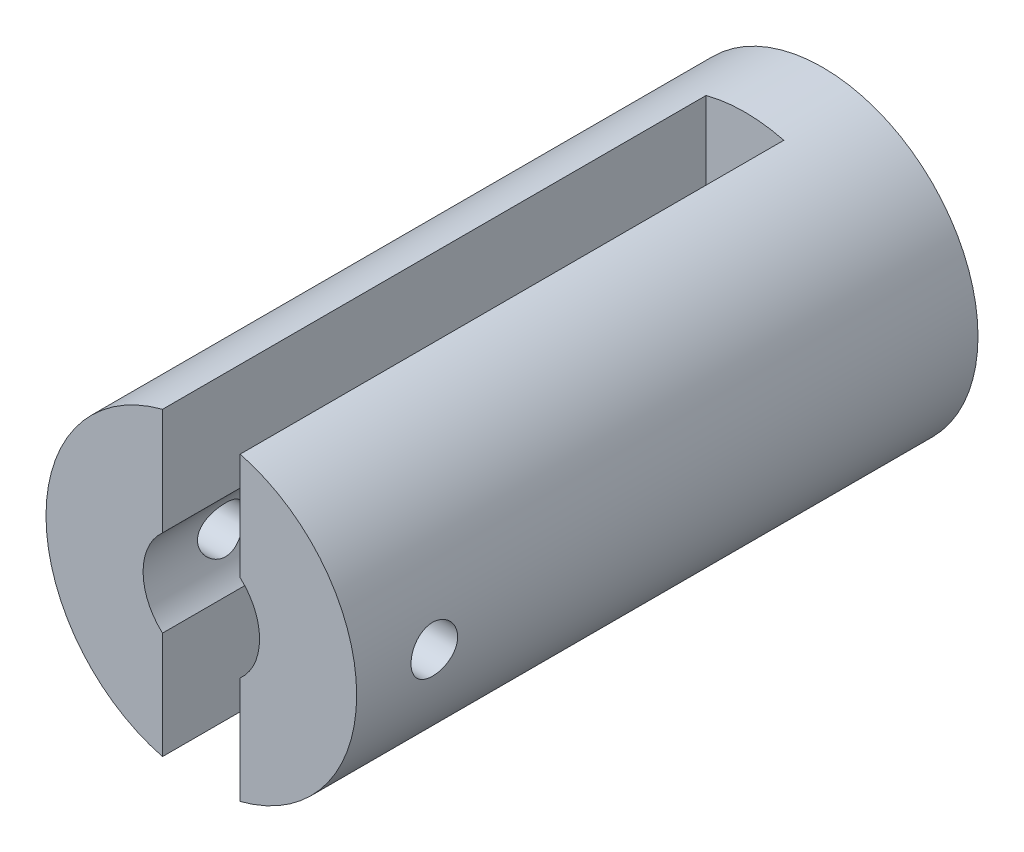
ISO-10303-21;
HEADER;
FILE_DESCRIPTION(('STEP AP214'),'2;1');
FILE_NAME('part.step','',(''),(''),'','','');
FILE_SCHEMA(('AUTOMOTIVE_DESIGN { 1 0 10303 214 1 1 1 1 }'));
ENDSEC;
DATA;
#1=APPLICATION_CONTEXT('core data for automotive mechanical design processes');
#2=APPLICATION_PROTOCOL_DEFINITION('international standard','automotive_design',2000,#1);
#3=PRODUCT_CONTEXT('',#1,'mechanical');
#4=PRODUCT('Part','Part','',(#3));
#5=PRODUCT_RELATED_PRODUCT_CATEGORY('part','',(#4));
#6=PRODUCT_DEFINITION_FORMATION('','',#4);
#7=PRODUCT_DEFINITION_CONTEXT('part definition',#1,'design');
#8=PRODUCT_DEFINITION('design','',#6,#7);
#9=PRODUCT_DEFINITION_SHAPE('','',#8);
#10=(LENGTH_UNIT() NAMED_UNIT(*) SI_UNIT(.MILLI.,.METRE.));
#11=(NAMED_UNIT(*) PLANE_ANGLE_UNIT() SI_UNIT($,.RADIAN.));
#12=(NAMED_UNIT(*) SI_UNIT($,.STERADIAN.) SOLID_ANGLE_UNIT());
#13=UNCERTAINTY_MEASURE_WITH_UNIT(LENGTH_MEASURE(1.E-05),#10,'distance_accuracy_value','');
#14=(GEOMETRIC_REPRESENTATION_CONTEXT(3) GLOBAL_UNCERTAINTY_ASSIGNED_CONTEXT((#13)) GLOBAL_UNIT_ASSIGNED_CONTEXT((#10,
#11,#12)) REPRESENTATION_CONTEXT('',''));
#15=CARTESIAN_POINT('',(0.,0.,0.));
#16=DIRECTION('',(0.,0.,1.));
#17=DIRECTION('',(1.,0.,0.));
#18=AXIS2_PLACEMENT_3D('',#15,#16,#17);
#19=CARTESIAN_POINT('',(2.5,-9.68245836551854,40.));
#20=DIRECTION('',(1.,0.,0.));
#21=DIRECTION('',(0.,0.,-1.));
#22=AXIS2_PLACEMENT_3D('',#19,#20,#21);
#23=PLANE('',#22);
#24=DIRECTION('',(0.,0.,-1.));
#25=VECTOR('',#24,1.);
#26=CARTESIAN_POINT('',(2.5,-2.79508497187474,51.5));
#27=LINE('',#26,#25);
#28=CARTESIAN_POINT('',(2.5,-2.79508497187474,5.));
#29=VERTEX_POINT('',#28);
#30=CARTESIAN_POINT('',(2.5,-2.79508497187474,40.));
#31=VERTEX_POINT('',#30);
#32=EDGE_CURVE('E182',#29,#31,#27,.F.);
#33=ORIENTED_EDGE('',*,*,#32,.F.);
#34=DIRECTION('',(0.,-1.,0.));
#35=VECTOR('',#34,1.);
#36=CARTESIAN_POINT('',(2.5,-9.68245836551854,5.));
#37=LINE('',#36,#35);
#38=CARTESIAN_POINT('',(2.5,-9.68245836551854,5.));
#39=VERTEX_POINT('',#38);
#40=EDGE_CURVE('E136',#29,#39,#37,.T.);
#41=ORIENTED_EDGE('',*,*,#40,.T.);
#42=DIRECTION('',(0.,0.,-1.));
#43=VECTOR('',#42,1.);
#44=CARTESIAN_POINT('',(2.5,-9.68245836551854,40.));
#45=LINE('',#44,#43);
#46=CARTESIAN_POINT('',(2.5,-9.68245836551854,40.));
#47=VERTEX_POINT('',#46);
#48=EDGE_CURVE('E144',#47,#39,#45,.T.);
#49=ORIENTED_EDGE('',*,*,#48,.F.);
#50=DIRECTION('',(0.,-1.,0.));
#51=VECTOR('',#50,1.);
#52=CARTESIAN_POINT('',(2.5,-9.68245836551854,40.));
#53=LINE('',#52,#51);
#54=EDGE_CURVE('E140',#31,#47,#53,.T.);
#55=ORIENTED_EDGE('',*,*,#54,.F.);
#56=EDGE_LOOP('',(#33,#41,#49,#55));
#57=FACE_BOUND('',#56,.T.);
#58=ADVANCED_FACE('F33',(#57),#23,.F.);
#59=DIRECTION('',(0.,0.,-1.));
#60=VECTOR('',#59,1.);
#61=CARTESIAN_POINT('',(2.5,2.79508497187474,51.5));
#62=LINE('',#61,#60);
#63=CARTESIAN_POINT('',(2.5,2.79508497187474,40.));
#64=VERTEX_POINT('',#63);
#65=CARTESIAN_POINT('',(2.5,2.79508497187474,5.));
#66=VERTEX_POINT('',#65);
#67=EDGE_CURVE('E113',#64,#66,#62,.T.);
#68=ORIENTED_EDGE('',*,*,#67,.F.);
#69=CARTESIAN_POINT('',(2.5,9.68245836551854,40.));
#70=VERTEX_POINT('',#69);
#71=EDGE_CURVE('E141',#70,#64,#53,.T.);
#72=ORIENTED_EDGE('',*,*,#71,.F.);
#73=DIRECTION('',(0.,0.,-1.));
#74=VECTOR('',#73,1.);
#75=CARTESIAN_POINT('',(2.5,9.68245836551854,40.));
#76=LINE('',#75,#74);
#77=CARTESIAN_POINT('',(2.5,9.68245836551854,5.));
#78=VERTEX_POINT('',#77);
#79=EDGE_CURVE('E165',#70,#78,#76,.T.);
#80=ORIENTED_EDGE('',*,*,#79,.T.);
#81=EDGE_CURVE('E57',#78,#66,#37,.T.);
#82=ORIENTED_EDGE('',*,*,#81,.T.);
#83=EDGE_LOOP('',(#68,#72,#80,#82));
#84=FACE_BOUND('',#83,.T.);
#85=ADVANCED_FACE('F239',(#84),#23,.F.);
#86=CARTESIAN_POINT('',(0.,0.,40.));
#87=DIRECTION('',(0.,0.,1.));
#88=DIRECTION('',(1.,0.,0.));
#89=AXIS2_PLACEMENT_3D('',#86,#87,#88);
#90=PLANE('',#89);
#91=ORIENTED_EDGE('',*,*,#71,.T.);
#92=CARTESIAN_POINT('',(0.,0.,40.));
#93=DIRECTION('',(0.,0.,1.));
#94=DIRECTION('',(1.,0.,0.));
#95=AXIS2_PLACEMENT_3D('',#92,#93,#94);
#96=CIRCLE('',#95,3.75);
#97=EDGE_CURVE('E222',#64,#31,#96,.F.);
#98=ORIENTED_EDGE('',*,*,#97,.T.);
#99=ORIENTED_EDGE('',*,*,#54,.T.);
#100=CARTESIAN_POINT('',(0.,0.,40.));
#101=DIRECTION('',(0.,0.,1.));
#102=DIRECTION('',(1.,0.,0.));
#103=AXIS2_PLACEMENT_3D('',#100,#101,#102);
#104=CIRCLE('',#103,10.);
#105=EDGE_CURVE('E137',#47,#70,#104,.T.);
#106=ORIENTED_EDGE('',*,*,#105,.T.);
#107=EDGE_LOOP('',(#91,#98,#99,#106));
#108=FACE_BOUND('',#107,.T.);
#109=ADVANCED_FACE('F244',(#108),#90,.T.);
#110=CARTESIAN_POINT('',(-2.5,-9.68245836551854,40.));
#111=DIRECTION('',(-1.,0.,0.));
#112=DIRECTION('',(0.,0.,1.));
#113=AXIS2_PLACEMENT_3D('',#110,#111,#112);
#114=PLANE('',#113);
#115=DIRECTION('',(0.,0.,-1.));
#116=VECTOR('',#115,1.);
#117=CARTESIAN_POINT('',(-2.5,2.79508497187474,51.5));
#118=LINE('',#117,#116);
#119=CARTESIAN_POINT('',(-2.5,2.79508497187474,5.));
#120=VERTEX_POINT('',#119);
#121=CARTESIAN_POINT('',(-2.5,2.79508497187474,40.));
#122=VERTEX_POINT('',#121);
#123=EDGE_CURVE('E100',#120,#122,#118,.F.);
#124=ORIENTED_EDGE('',*,*,#123,.F.);
#125=DIRECTION('',(0.,1.,0.));
#126=VECTOR('',#125,1.);
#127=CARTESIAN_POINT('',(-2.5,-9.68245836551854,5.));
#128=LINE('',#127,#126);
#129=CARTESIAN_POINT('',(-2.5,9.68245836551854,5.));
#130=VERTEX_POINT('',#129);
#131=EDGE_CURVE('E51',#120,#130,#128,.T.);
#132=ORIENTED_EDGE('',*,*,#131,.T.);
#133=DIRECTION('',(0.,0.,-1.));
#134=VECTOR('',#133,1.);
#135=CARTESIAN_POINT('',(-2.5,9.68245836551854,40.));
#136=LINE('',#135,#134);
#137=CARTESIAN_POINT('',(-2.5,9.68245836551854,40.));
#138=VERTEX_POINT('',#137);
#139=EDGE_CURVE('E131',#138,#130,#136,.T.);
#140=ORIENTED_EDGE('',*,*,#139,.F.);
#141=DIRECTION('',(0.,1.,0.));
#142=VECTOR('',#141,1.);
#143=CARTESIAN_POINT('',(-2.5,-9.68245836551854,40.));
#144=LINE('',#143,#142);
#145=EDGE_CURVE('E103',#122,#138,#144,.T.);
#146=ORIENTED_EDGE('',*,*,#145,.F.);
#147=EDGE_LOOP('',(#124,#132,#140,#146));
#148=FACE_BOUND('',#147,.T.);
#149=ADVANCED_FACE('F102',(#148),#114,.F.);
#150=DIRECTION('',(0.,0.,-1.));
#151=VECTOR('',#150,1.);
#152=CARTESIAN_POINT('',(-2.5,-2.79508497187474,51.5));
#153=LINE('',#152,#151);
#154=CARTESIAN_POINT('',(-2.5,-2.79508497187474,40.));
#155=VERTEX_POINT('',#154);
#156=CARTESIAN_POINT('',(-2.5,-2.79508497187474,5.));
#157=VERTEX_POINT('',#156);
#158=EDGE_CURVE('E107',#155,#157,#153,.T.);
#159=ORIENTED_EDGE('',*,*,#158,.F.);
#160=CARTESIAN_POINT('',(-2.5,-9.68245836551854,40.));
#161=VERTEX_POINT('',#160);
#162=EDGE_CURVE('E129',#161,#155,#144,.T.);
#163=ORIENTED_EDGE('',*,*,#162,.F.);
#164=DIRECTION('',(0.,0.,-1.));
#165=VECTOR('',#164,1.);
#166=CARTESIAN_POINT('',(-2.5,-9.68245836551854,40.));
#167=LINE('',#166,#165);
#168=CARTESIAN_POINT('',(-2.5,-9.68245836551854,5.));
#169=VERTEX_POINT('',#168);
#170=EDGE_CURVE('E133',#161,#169,#167,.T.);
#171=ORIENTED_EDGE('',*,*,#170,.T.);
#172=EDGE_CURVE('E119',#169,#157,#128,.T.);
#173=ORIENTED_EDGE('',*,*,#172,.T.);
#174=EDGE_LOOP('',(#159,#163,#171,#173));
#175=FACE_BOUND('',#174,.T.);
#176=ADVANCED_FACE('F189',(#175),#114,.F.);
#177=CARTESIAN_POINT('',(0.,0.,40.));
#178=DIRECTION('',(0.,0.,1.));
#179=DIRECTION('',(1.,0.,0.));
#180=AXIS2_PLACEMENT_3D('',#177,#178,#179);
#181=PLANE('',#180);
#182=ORIENTED_EDGE('',*,*,#162,.T.);
#183=CARTESIAN_POINT('',(0.,0.,40.));
#184=DIRECTION('',(0.,0.,1.));
#185=DIRECTION('',(1.,0.,0.));
#186=AXIS2_PLACEMENT_3D('',#183,#184,#185);
#187=CIRCLE('',#186,3.75);
#188=EDGE_CURVE('E106',#155,#122,#187,.F.);
#189=ORIENTED_EDGE('',*,*,#188,.T.);
#190=ORIENTED_EDGE('',*,*,#145,.T.);
#191=CARTESIAN_POINT('',(0.,0.,40.));
#192=DIRECTION('',(0.,0.,1.));
#193=DIRECTION('',(1.,0.,0.));
#194=AXIS2_PLACEMENT_3D('',#191,#192,#193);
#195=CIRCLE('',#194,10.);
#196=EDGE_CURVE('E123',#138,#161,#195,.T.);
#197=ORIENTED_EDGE('',*,*,#196,.T.);
#198=EDGE_LOOP('',(#182,#189,#190,#197));
#199=FACE_BOUND('',#198,.T.);
#200=ADVANCED_FACE('F206',(#199),#181,.T.);
#201=CARTESIAN_POINT('',(22.5,0.,35.));
#202=DIRECTION('',(-1.,0.,0.));
#203=DIRECTION('',(0.,0.,1.));
#204=AXIS2_PLACEMENT_3D('',#201,#202,#203);
#205=CYLINDRICAL_SURFACE('',#204,1.5);
#206=CARTESIAN_POINT('',(-10.,0.,36.5));
#207=CARTESIAN_POINT('',(-9.99999865771297,-0.0837515444816427,36.4999965461848));
#208=CARTESIAN_POINT('',(-9.9989368253704,-0.167551685082133,36.4929619991594));
#209=CARTESIAN_POINT('',(-9.99480315973187,-0.332809627994914,36.4650168000173));
#210=CARTESIAN_POINT('',(-9.99172936938473,-0.41426506897423,36.4440926370551));
#211=CARTESIAN_POINT('',(-9.98391721219526,-0.572418086221861,36.3890074950324));
#212=CARTESIAN_POINT('',(-9.97918010370919,-0.649119207826799,36.3548565204941));
#213=CARTESIAN_POINT('',(-9.96856475911724,-0.795690428635255,36.2743116205831));
#214=CARTESIAN_POINT('',(-9.96268668152773,-0.865561474725191,36.2279193955826));
#215=CARTESIAN_POINT('',(-9.95039170991452,-0.997046719562129,36.1238227350601));
#216=CARTESIAN_POINT('',(-9.94397133890331,-1.0585998322255,36.0660415437918));
#217=CARTESIAN_POINT('',(-9.93134261133239,-1.17117490668949,35.9409723111061));
#218=CARTESIAN_POINT('',(-9.92513426698505,-1.22219626272936,35.8736837232215));
#219=CARTESIAN_POINT('',(-9.91359877458726,-1.31249729499943,35.7310993564775));
#220=CARTESIAN_POINT('',(-9.90827611975031,-1.35171787037205,35.6557657530187));
#221=CARTESIAN_POINT('',(-9.89916211306268,-1.41692632171056,35.4994871793546));
#222=CARTESIAN_POINT('',(-9.89537067775449,-1.44291491889163,35.4185425152561));
#223=CARTESIAN_POINT('',(-9.88978256218673,-1.48073198798911,35.2539819581283));
#224=CARTESIAN_POINT('',(-9.8879711574125,-1.49266503640518,35.170390606592));
#225=CARTESIAN_POINT('',(-9.88650348970582,-1.50235624033933,35.0023738340127));
#226=CARTESIAN_POINT('',(-9.88684710303147,-1.50011520973797,34.9179484611375));
#227=CARTESIAN_POINT('',(-9.88963718352409,-1.48160733250788,34.7513989198059));
#228=CARTESIAN_POINT('',(-9.89206618761549,-1.46545695927751,34.6692614735152));
#229=CARTESIAN_POINT('',(-9.89872608126367,-1.41977117403735,34.5088756311285));
#230=CARTESIAN_POINT('',(-9.90295702179379,-1.39023538337812,34.4306273451193));
#231=CARTESIAN_POINT('',(-9.91276335545481,-1.31849603529737,34.2798866287171));
#232=CARTESIAN_POINT('',(-9.91834396766526,-1.27624314283198,34.2074180309076));
#233=CARTESIAN_POINT('',(-9.93021707574548,-1.18030413128955,34.0705554042181));
#234=CARTESIAN_POINT('',(-9.93650961832501,-1.12661726182479,34.0061619057306));
#235=CARTESIAN_POINT('',(-9.9491747305621,-1.00869493078248,33.8866023392603));
#236=CARTESIAN_POINT('',(-9.95554747112815,-0.944359329642007,33.8315350097137));
#237=CARTESIAN_POINT('',(-9.96759647648462,-0.807307089894192,33.7329640654927));
#238=CARTESIAN_POINT('',(-9.9732727382251,-0.734590414588176,33.6894605014561));
#239=CARTESIAN_POINT('',(-9.98329515585393,-0.58275459821369,33.6152469135005));
#240=CARTESIAN_POINT('',(-9.98764051925428,-0.503631677836783,33.5845445081597));
#241=CARTESIAN_POINT('',(-9.99450490557069,-0.341273182487061,33.5368906103146));
#242=CARTESIAN_POINT('',(-9.99702405195467,-0.2580378859526,33.5199381881844));
#243=CARTESIAN_POINT('',(-9.99993581133871,-0.0906695676436447,33.5003967701833));
#244=CARTESIAN_POINT('',(-10.0003485209039,-0.00655273187046912,33.4976720286207));
#245=CARTESIAN_POINT('',(-9.99905561015226,0.160936677662284,33.506303005311));
#246=CARTESIAN_POINT('',(-9.99735005541369,0.244309274381878,33.5176582876681));
#247=CARTESIAN_POINT('',(-9.99202468615333,0.407532387431409,33.5540141001775));
#248=CARTESIAN_POINT('',(-9.98841415207984,0.487397963079839,33.5789484960308));
#249=CARTESIAN_POINT('',(-9.97968235658369,0.641814958643,33.6416849974618));
#250=CARTESIAN_POINT('',(-9.97456102421565,0.716366128795101,33.6794877073336));
#251=CARTESIAN_POINT('',(-9.96332682468686,0.858634979291924,33.7672062245639));
#252=CARTESIAN_POINT('',(-9.95720701626745,0.92629900989157,33.8172081400128));
#253=CARTESIAN_POINT('',(-9.94467863012165,1.05232367317771,33.9277858116287));
#254=CARTESIAN_POINT('',(-9.93827003562867,1.11068376479341,33.9883621823247));
#255=CARTESIAN_POINT('',(-9.92582264304494,1.21693784957196,34.1189735331765));
#256=CARTESIAN_POINT('',(-9.91978736017588,1.26474084747421,34.1890829251948));
#257=CARTESIAN_POINT('',(-9.90883219104903,1.34789129270584,34.3364160405118));
#258=CARTESIAN_POINT('',(-9.90391227465629,1.38323907656436,34.4136395715215));
#259=CARTESIAN_POINT('',(-9.89577033008645,1.44033467323944,34.5727375336231));
#260=CARTESIAN_POINT('',(-9.89254233006438,1.46213037141636,34.6545944609712));
#261=CARTESIAN_POINT('',(-9.88813382297802,1.49165549501587,34.8208590154351));
#262=CARTESIAN_POINT('',(-9.88695317451771,1.49938589183067,34.9052664659947));
#263=CARTESIAN_POINT('',(-9.88677832610841,1.5005378666944,35.0733290633158));
#264=CARTESIAN_POINT('',(-9.88776226333502,1.49410252167313,35.1569832417569));
#265=CARTESIAN_POINT('',(-9.89175820611174,1.46741229544379,35.3220052633235));
#266=CARTESIAN_POINT('',(-9.89477020841118,1.44715743638627,35.4033731101134));
#267=CARTESIAN_POINT('',(-9.90247526112297,1.39345373518666,35.5614730822343));
#268=CARTESIAN_POINT('',(-9.90716703716075,1.36001489324314,35.6382086704334));
#269=CARTESIAN_POINT('',(-9.91770454557702,1.28090667642309,35.7850036338024));
#270=CARTESIAN_POINT('',(-9.92355031702723,1.23523688741502,35.8550627828036));
#271=CARTESIAN_POINT('',(-9.93580743364938,1.13244337659164,35.9872430579752));
#272=CARTESIAN_POINT('',(-9.94222367881967,1.07521369039806,36.0492813332471));
#273=CARTESIAN_POINT('',(-9.95485788826637,0.951148841082835,36.1629245547878));
#274=CARTESIAN_POINT('',(-9.96107580610759,0.884311448350943,36.2145270725762));
#275=CARTESIAN_POINT('',(-9.9726518579052,0.742495707543724,36.3060876766074));
#276=CARTESIAN_POINT('',(-9.9780050712882,0.667474576764763,36.3459801092148));
#277=CARTESIAN_POINT('',(-9.9872002880296,0.511751870248722,36.412538516758));
#278=CARTESIAN_POINT('',(-9.99104385565757,0.431056277096709,36.4392181900537));
#279=CARTESIAN_POINT('',(-9.99590939261506,0.291665727889334,36.4725413427101));
#280=CARTESIAN_POINT('',(-9.99743549179557,0.233831133495283,36.4828226015388));
#281=CARTESIAN_POINT('',(-9.99948125947896,0.117338971600127,36.4965530977126));
#282=CARTESIAN_POINT('',(-10.0000009404877,0.0586814143344182,36.5000024199526));
#283=CARTESIAN_POINT('',(-10.,0.,36.5));
#284=B_SPLINE_CURVE_WITH_KNOTS('',3,(#206,#207,#208,#209,#210,#211,#212,#213,#214,#215,#216,
#217,#218,#219,#220,#221,#222,#223,#224,#225,#226,#227,#228,#229,#230,#231,#232,#233,#234,#235,
#236,#237,#238,#239,#240,#241,#242,#243,#244,#245,#246,#247,#248,#249,#250,#251,#252,#253,#254,
#255,#256,#257,#258,#259,#260,#261,#262,#263,#264,#265,#266,#267,#268,#269,#270,#271,#272,#273,
#274,#275,#276,#277,#278,#279,#280,#281,#282,#283),.UNSPECIFIED.,.T.,.F.,(4,2,2,2,2,2,2,2,2,2,2,
2,2,2,2,2,2,2,2,2,2,2,2,2,2,2,2,2,2,2,2,2,2,2,2,2,2,2,4),(0.,0.251040205031665,
0.502324962929151,0.753420023583239,1.0044802241976,1.25729416136844,1.5101226357258,
1.76419702395375,2.01825756225506,2.27041564605925,2.52255925098983,2.77261177195747,
3.02267136690362,3.27371383476159,3.52477278308534,3.77834291255409,4.03191415238668,
4.28563608984875,4.53934087193402,4.79062058544256,5.04189251991156,5.29195148965949,
5.54202220376275,5.79391188036909,6.04581620028631,6.29981366584673,6.55380426808834,
6.8068922345717,7.05996272137179,7.31048888261066,7.56101464229565,7.81135073984148,
8.06169531466881,8.31444829965723,8.56726003468735,8.82146323384735,9.07540233261443,
9.2512985197881,9.42719252123293),.UNSPECIFIED.);
#285=CARTESIAN_POINT('',(-10.,0.,36.5));
#286=VERTEX_POINT('',#285);
#287=EDGE_CURVE('E120',#286,#286,#284,.T.);
#288=ORIENTED_EDGE('',*,*,#287,.F.);
#289=EDGE_LOOP('',(#288));
#290=FACE_BOUND('',#289,.T.);
#291=CARTESIAN_POINT('',(-3.75,0.,36.5));
#292=CARTESIAN_POINT('',(-3.74999453420313,0.0806197540821692,36.4999926111322));
#293=CARTESIAN_POINT('',(-3.74736970730199,0.161379423068007,36.4934616859337));
#294=CARTESIAN_POINT('',(-3.73712589825481,0.320622360313424,36.4675642223591));
#295=CARTESIAN_POINT('',(-3.72949334024158,0.399098833170937,36.4481627906854));
#296=CARTESIAN_POINT('',(-3.71005656909839,0.551215442045552,36.3973429414559));
#297=CARTESIAN_POINT('',(-3.69826602273054,0.624870496212719,36.3659638653375));
#298=CARTESIAN_POINT('',(-3.67167458097058,0.765803977746276,36.2922356200051));
#299=CARTESIAN_POINT('',(-3.65687473093542,0.833084607563246,36.2498902588108));
#300=CARTESIAN_POINT('',(-3.62498164627814,0.962625755677798,36.1533233760793));
#301=CARTESIAN_POINT('',(-3.60781722696893,1.02454670441266,36.0986700078198));
#302=CARTESIAN_POINT('',(-3.57345432679646,1.13863125358854,35.9799499973924));
#303=CARTESIAN_POINT('',(-3.55625583340344,1.19079008035015,35.9158787770912));
#304=CARTESIAN_POINT('',(-3.52292093847852,1.28615592546966,35.7766789473183));
#305=CARTESIAN_POINT('',(-3.50686586973713,1.32886123589661,35.7011851354826));
#306=CARTESIAN_POINT('',(-3.47875235390094,1.40081603927787,35.543347701185));
#307=CARTESIAN_POINT('',(-3.46669200933132,1.43007192321438,35.4610073541137));
#308=CARTESIAN_POINT('',(-3.44869768245614,1.47292411754691,35.2957157498059));
#309=CARTESIAN_POINT('',(-3.44251065266703,1.48717047435424,35.2129615733178));
#310=CARTESIAN_POINT('',(-3.43623003036858,1.50162972123003,35.0460237512696));
#311=CARTESIAN_POINT('',(-3.43613344142076,1.50184951223492,34.9618408290312));
#312=CARTESIAN_POINT('',(-3.44182875209995,1.48874202562841,34.8006824964065));
#313=CARTESIAN_POINT('',(-3.44721131278837,1.47635648572886,34.7236132141932));
#314=CARTESIAN_POINT('',(-3.46257140705877,1.43996016022337,34.572755332995));
#315=CARTESIAN_POINT('',(-3.47254974241254,1.41594734610348,34.4989673089173));
#316=CARTESIAN_POINT('',(-3.49619613816397,1.35652104941331,34.354986622853));
#317=CARTESIAN_POINT('',(-3.50993534460591,1.32088489673649,34.284898070709));
#318=CARTESIAN_POINT('',(-3.53953587292417,1.23937984554916,34.1514381377288));
#319=CARTESIAN_POINT('',(-3.55539799092636,1.19350710382564,34.0880692929479));
#320=CARTESIAN_POINT('',(-3.58895052556703,1.08866294959083,33.9646927033985));
#321=CARTESIAN_POINT('',(-3.60668748732114,1.02895309722798,33.9053234529155));
#322=CARTESIAN_POINT('',(-3.64094868718711,0.900235820572651,33.7972366414985));
#323=CARTESIAN_POINT('',(-3.65747268333993,0.831226549000833,33.7485212019423));
#324=CARTESIAN_POINT('',(-3.68786010948411,0.68405823945439,33.6622869144381));
#325=CARTESIAN_POINT('',(-3.70166452571561,0.605745368509865,33.6250082891022));
#326=CARTESIAN_POINT('',(-3.72461121246569,0.443267824112167,33.5643741041915));
#327=CARTESIAN_POINT('',(-3.73375585096787,0.35910614763726,33.5410114718319));
#328=CARTESIAN_POINT('',(-3.74592104630183,0.192671915705868,33.5101637784352));
#329=CARTESIAN_POINT('',(-3.74927209375136,0.110582470489153,33.5018206593098));
#330=CARTESIAN_POINT('',(-3.75051358882973,-0.0538839823558609,33.4987151746035));
#331=CARTESIAN_POINT('',(-3.74840545186719,-0.136260909917941,33.5039492888394));
#332=CARTESIAN_POINT('',(-3.73918175297815,-0.295074554341489,33.527218814414));
#333=CARTESIAN_POINT('',(-3.73229543509143,-0.371611868831603,33.5446684852632));
#334=CARTESIAN_POINT('',(-3.71444581054125,-0.520601571045583,33.5910767812324));
#335=CARTESIAN_POINT('',(-3.70348198017398,-0.593053432668632,33.6200368847515));
#336=CARTESIAN_POINT('',(-3.67812446078109,-0.734309089362527,33.68958870476));
#337=CARTESIAN_POINT('',(-3.66363611984853,-0.802933517066556,33.7305091040324));
#338=CARTESIAN_POINT('',(-3.63280023559143,-0.932582693434919,33.8224552429292));
#339=CARTESIAN_POINT('',(-3.61645194832703,-0.993604380570845,33.873485032192));
#340=CARTESIAN_POINT('',(-3.58233838228584,-1.11054228227162,33.9881525097122));
#341=CARTESIAN_POINT('',(-3.56455081068789,-1.16585545035455,34.0524001561297));
#342=CARTESIAN_POINT('',(-3.53056254687849,-1.26506339806029,34.189580062257));
#343=CARTESIAN_POINT('',(-3.51436211644883,-1.30895629600313,34.262513750255));
#344=CARTESIAN_POINT('',(-3.48535724930781,-1.38435562644873,34.4160962709456));
#345=CARTESIAN_POINT('',(-3.47258723163591,-1.41573794590085,34.4968129994092));
#346=CARTESIAN_POINT('',(-3.45242755108448,-1.46422216477898,34.6630502387864));
#347=CARTESIAN_POINT('',(-3.44503391771999,-1.48133460395199,34.7485671543593));
#348=CARTESIAN_POINT('',(-3.43703819474945,-1.4997867129588,34.9153459263309));
#349=CARTESIAN_POINT('',(-3.43598565756128,-1.50217281172715,34.996471129695));
#350=CARTESIAN_POINT('',(-3.43961127024823,-1.49385236945815,35.157908643285));
#351=CARTESIAN_POINT('',(-3.44428869243595,-1.48314749093534,35.2382210554269));
#352=CARTESIAN_POINT('',(-3.45844986809265,-1.44980352461524,35.3924991423913));
#353=CARTESIAN_POINT('',(-3.46773623870587,-1.42765312017824,35.4665902058248));
#354=CARTESIAN_POINT('',(-3.48993000924522,-1.37250408636826,35.6100339722101));
#355=CARTESIAN_POINT('',(-3.50283840904505,-1.33950246104536,35.6793853601749));
#356=CARTESIAN_POINT('',(-3.53173957203368,-1.2614045720698,35.8157072144531));
#357=CARTESIAN_POINT('',(-3.54786661734931,-1.21572400136962,35.8823140025979));
#358=CARTESIAN_POINT('',(-3.58097853279178,-1.11441908945363,36.0072449879028));
#359=CARTESIAN_POINT('',(-3.59796366036305,-1.05879175111359,36.0655666790962));
#360=CARTESIAN_POINT('',(-3.63220175315545,-0.93487912970435,36.1761521399477));
#361=CARTESIAN_POINT('',(-3.64940068471639,-0.866007000859608,36.2277779801736));
#362=CARTESIAN_POINT('',(-3.68100305035287,-0.71992524021434,36.3187527819662));
#363=CARTESIAN_POINT('',(-3.6954051831968,-0.642711753410433,36.3580960341144));
#364=CARTESIAN_POINT('',(-3.71954786111896,-0.483553546871405,36.4224666613927));
#365=CARTESIAN_POINT('',(-3.72937022291271,-0.401723713664773,36.4477469926703));
#366=CARTESIAN_POINT('',(-3.74358229657024,-0.234657409710915,36.4839793407157));
#367=CARTESIAN_POINT('',(-3.74798924621728,-0.149432644394184,36.4949768275579));
#368=CARTESIAN_POINT('',(-3.74981924628102,-0.0426842234181974,36.4995465357337));
#369=CARTESIAN_POINT('',(-3.75000144726882,-0.0213470165555689,36.5000019564719));
#370=CARTESIAN_POINT('',(-3.75,0.,36.5));
#371=B_SPLINE_CURVE_WITH_KNOTS('',3,(#291,#292,#293,#294,#295,#296,#297,#298,#299,#300,#301,
#302,#303,#304,#305,#306,#307,#308,#309,#310,#311,#312,#313,#314,#315,#316,#317,#318,#319,#320,
#321,#322,#323,#324,#325,#326,#327,#328,#329,#330,#331,#332,#333,#334,#335,#336,#337,#338,#339,
#340,#341,#342,#343,#344,#345,#346,#347,#348,#349,#350,#351,#352,#353,#354,#355,#356,#357,#358,
#359,#360,#361,#362,#363,#364,#365,#366,#367,#368,#369,#370),.UNSPECIFIED.,.T.,.F.,(4,2,2,2,2,2,
2,2,2,2,2,2,2,2,2,2,2,2,2,2,2,2,2,2,2,2,2,2,2,2,2,2,2,2,2,2,2,2,2,4),(0.,0.241802240919805,
0.484262727005952,0.725933593103685,0.967520651759883,1.21948036275298,1.47156296200809,
1.73486444114413,1.99804067338702,2.24928078981623,2.50039729755366,2.7340374630103,
2.96771840442036,3.20616844724113,3.44470816453638,3.70168761889918,3.958718196298,
4.22082684872105,4.48280217085344,4.72926888396007,4.97567170177563,5.21100341673275,
5.44636536745349,5.68892635048699,5.93158469624228,6.19026355968312,6.44898501782812,
6.71021283855624,6.97124754484452,7.21349755044563,7.45571679422286,7.68835738911579,
7.92106226853872,8.16709101042521,8.41319401011297,8.67525317650379,8.93743397730402,
9.19473225759992,9.45120939303259,9.51523534422599),.UNSPECIFIED.);
#372=CARTESIAN_POINT('',(-3.75,0.,36.5));
#373=VERTEX_POINT('',#372);
#374=EDGE_CURVE('E221',#373,#373,#371,.T.);
#375=ORIENTED_EDGE('',*,*,#374,.F.);
#376=EDGE_LOOP('',(#375));
#377=FACE_BOUND('',#376,.T.);
#378=ADVANCED_FACE('F200',(#290,#377),#205,.F.);
#379=CARTESIAN_POINT('',(10.,0.,36.5));
#380=CARTESIAN_POINT('',(9.99999865771297,0.0837515444816427,36.4999965461848));
#381=CARTESIAN_POINT('',(9.9989368253704,0.167551685082133,36.4929619991594));
#382=CARTESIAN_POINT('',(9.99480315973187,0.332809627994914,36.4650168000173));
#383=CARTESIAN_POINT('',(9.99172936938473,0.41426506897423,36.4440926370551));
#384=CARTESIAN_POINT('',(9.98391721219526,0.572418086221861,36.3890074950324));
#385=CARTESIAN_POINT('',(9.97918010370919,0.649119207826799,36.3548565204941));
#386=CARTESIAN_POINT('',(9.96856475911724,0.795690428635255,36.2743116205831));
#387=CARTESIAN_POINT('',(9.96268668152773,0.865561474725191,36.2279193955826));
#388=CARTESIAN_POINT('',(9.95039170991452,0.997046719562129,36.1238227350601));
#389=CARTESIAN_POINT('',(9.94397133890331,1.0585998322255,36.0660415437918));
#390=CARTESIAN_POINT('',(9.93134261133239,1.17117490668949,35.9409723111061));
#391=CARTESIAN_POINT('',(9.92513426698505,1.22219626272936,35.8736837232215));
#392=CARTESIAN_POINT('',(9.91359877458726,1.31249729499943,35.7310993564775));
#393=CARTESIAN_POINT('',(9.90827611975031,1.35171787037205,35.6557657530187));
#394=CARTESIAN_POINT('',(9.89916211306268,1.41692632171056,35.4994871793546));
#395=CARTESIAN_POINT('',(9.89537067775449,1.44291491889163,35.4185425152561));
#396=CARTESIAN_POINT('',(9.88978256218673,1.48073198798911,35.2539819581283));
#397=CARTESIAN_POINT('',(9.8879711574125,1.49266503640518,35.170390606592));
#398=CARTESIAN_POINT('',(9.88650348970582,1.50235624033933,35.0023738340127));
#399=CARTESIAN_POINT('',(9.88684710303147,1.50011520973797,34.9179484611375));
#400=CARTESIAN_POINT('',(9.88963718352409,1.48160733250788,34.7513989198059));
#401=CARTESIAN_POINT('',(9.89206618761549,1.46545695927751,34.6692614735152));
#402=CARTESIAN_POINT('',(9.89872608126367,1.41977117403735,34.5088756311285));
#403=CARTESIAN_POINT('',(9.90295702179379,1.39023538337812,34.4306273451193));
#404=CARTESIAN_POINT('',(9.91276335545481,1.31849603529737,34.2798866287171));
#405=CARTESIAN_POINT('',(9.91834396766526,1.27624314283198,34.2074180309076));
#406=CARTESIAN_POINT('',(9.93021707574548,1.18030413128955,34.0705554042181));
#407=CARTESIAN_POINT('',(9.93650961832501,1.12661726182479,34.0061619057306));
#408=CARTESIAN_POINT('',(9.9491747305621,1.00869493078248,33.8866023392603));
#409=CARTESIAN_POINT('',(9.95554747112815,0.944359329642007,33.8315350097137));
#410=CARTESIAN_POINT('',(9.96759647648462,0.807307089894192,33.7329640654927));
#411=CARTESIAN_POINT('',(9.9732727382251,0.734590414588176,33.6894605014561));
#412=CARTESIAN_POINT('',(9.98329515585393,0.58275459821369,33.6152469135005));
#413=CARTESIAN_POINT('',(9.98764051925428,0.503631677836783,33.5845445081597));
#414=CARTESIAN_POINT('',(9.99450490557069,0.341273182487061,33.5368906103146));
#415=CARTESIAN_POINT('',(9.99702405195467,0.2580378859526,33.5199381881844));
#416=CARTESIAN_POINT('',(9.99993581133871,0.0906695676436447,33.5003967701833));
#417=CARTESIAN_POINT('',(10.0003485209039,0.00655273187046912,33.4976720286207));
#418=CARTESIAN_POINT('',(9.99905561015226,-0.160936677662284,33.506303005311));
#419=CARTESIAN_POINT('',(9.99735005541369,-0.244309274381878,33.5176582876681));
#420=CARTESIAN_POINT('',(9.99202468615333,-0.407532387431409,33.5540141001775));
#421=CARTESIAN_POINT('',(9.98841415207984,-0.487397963079839,33.5789484960308));
#422=CARTESIAN_POINT('',(9.97968235658369,-0.641814958643,33.6416849974618));
#423=CARTESIAN_POINT('',(9.97456102421565,-0.716366128795101,33.6794877073336));
#424=CARTESIAN_POINT('',(9.96332682468686,-0.858634979291924,33.7672062245639));
#425=CARTESIAN_POINT('',(9.95720701626745,-0.92629900989157,33.8172081400128));
#426=CARTESIAN_POINT('',(9.94467863012165,-1.05232367317771,33.9277858116287));
#427=CARTESIAN_POINT('',(9.93827003562867,-1.11068376479341,33.9883621823247));
#428=CARTESIAN_POINT('',(9.92582264304494,-1.21693784957196,34.1189735331765));
#429=CARTESIAN_POINT('',(9.91978736017588,-1.26474084747421,34.1890829251948));
#430=CARTESIAN_POINT('',(9.90883219104903,-1.34789129270584,34.3364160405118));
#431=CARTESIAN_POINT('',(9.90391227465629,-1.38323907656436,34.4136395715215));
#432=CARTESIAN_POINT('',(9.89577033008645,-1.44033467323944,34.5727375336231));
#433=CARTESIAN_POINT('',(9.89254233006438,-1.46213037141636,34.6545944609712));
#434=CARTESIAN_POINT('',(9.88813382297802,-1.49165549501587,34.8208590154351));
#435=CARTESIAN_POINT('',(9.88695317451771,-1.49938589183067,34.9052664659947));
#436=CARTESIAN_POINT('',(9.88677832610841,-1.5005378666944,35.0733290633158));
#437=CARTESIAN_POINT('',(9.88776226333502,-1.49410252167313,35.1569832417569));
#438=CARTESIAN_POINT('',(9.89175820611174,-1.46741229544379,35.3220052633235));
#439=CARTESIAN_POINT('',(9.89477020841118,-1.44715743638627,35.4033731101134));
#440=CARTESIAN_POINT('',(9.90247526112297,-1.39345373518666,35.5614730822343));
#441=CARTESIAN_POINT('',(9.90716703716075,-1.36001489324314,35.6382086704334));
#442=CARTESIAN_POINT('',(9.91770454557702,-1.28090667642309,35.7850036338024));
#443=CARTESIAN_POINT('',(9.92355031702723,-1.23523688741502,35.8550627828036));
#444=CARTESIAN_POINT('',(9.93580743364938,-1.13244337659164,35.9872430579752));
#445=CARTESIAN_POINT('',(9.94222367881967,-1.07521369039806,36.0492813332471));
#446=CARTESIAN_POINT('',(9.95485788826637,-0.951148841082835,36.1629245547878));
#447=CARTESIAN_POINT('',(9.96107580610759,-0.884311448350943,36.2145270725762));
#448=CARTESIAN_POINT('',(9.9726518579052,-0.742495707543724,36.3060876766074));
#449=CARTESIAN_POINT('',(9.9780050712882,-0.667474576764763,36.3459801092148));
#450=CARTESIAN_POINT('',(9.9872002880296,-0.511751870248722,36.412538516758));
#451=CARTESIAN_POINT('',(9.99104385565757,-0.431056277096709,36.4392181900537));
#452=CARTESIAN_POINT('',(9.99590939261506,-0.291665727889334,36.4725413427101));
#453=CARTESIAN_POINT('',(9.99743549179557,-0.233831133495283,36.4828226015388));
#454=CARTESIAN_POINT('',(9.99948125947896,-0.117338971600127,36.4965530977126));
#455=CARTESIAN_POINT('',(10.0000009404877,-0.0586814143344182,36.5000024199526));
#456=CARTESIAN_POINT('',(10.,0.,36.5));
#457=B_SPLINE_CURVE_WITH_KNOTS('',3,(#379,#380,#381,#382,#383,#384,#385,#386,#387,#388,#389,
#390,#391,#392,#393,#394,#395,#396,#397,#398,#399,#400,#401,#402,#403,#404,#405,#406,#407,#408,
#409,#410,#411,#412,#413,#414,#415,#416,#417,#418,#419,#420,#421,#422,#423,#424,#425,#426,#427,
#428,#429,#430,#431,#432,#433,#434,#435,#436,#437,#438,#439,#440,#441,#442,#443,#444,#445,#446,
#447,#448,#449,#450,#451,#452,#453,#454,#455,#456),.UNSPECIFIED.,.T.,.F.,(4,2,2,2,2,2,2,2,2,2,2,
2,2,2,2,2,2,2,2,2,2,2,2,2,2,2,2,2,2,2,2,2,2,2,2,2,2,2,4),(0.,0.251040205031665,
0.502324962929151,0.753420023583239,1.0044802241976,1.25729416136844,1.5101226357258,
1.76419702395375,2.01825756225506,2.27041564605925,2.52255925098983,2.77261177195747,
3.02267136690362,3.27371383476159,3.52477278308534,3.77834291255409,4.03191415238668,
4.28563608984875,4.53934087193402,4.79062058544256,5.04189251991156,5.29195148965949,
5.54202220376275,5.79391188036909,6.04581620028631,6.29981366584673,6.55380426808834,
6.8068922345717,7.05996272137179,7.31048888261066,7.56101464229565,7.81135073984148,
8.06169531466881,8.31444829965723,8.56726003468735,8.82146323384735,9.07540233261443,
9.2512985197881,9.42719252123293),.UNSPECIFIED.);
#458=CARTESIAN_POINT('',(10.,0.,36.5));
#459=VERTEX_POINT('',#458);
#460=EDGE_CURVE('E125',#459,#459,#457,.T.);
#461=ORIENTED_EDGE('',*,*,#460,.F.);
#462=EDGE_LOOP('',(#461));
#463=FACE_BOUND('',#462,.T.);
#464=CARTESIAN_POINT('',(3.75,0.,36.5));
#465=CARTESIAN_POINT('',(3.74999453420313,-0.0806197540821692,36.4999926111322));
#466=CARTESIAN_POINT('',(3.74736970730199,-0.161379423068007,36.4934616859337));
#467=CARTESIAN_POINT('',(3.73712589825481,-0.320622360313424,36.4675642223591));
#468=CARTESIAN_POINT('',(3.72949334024158,-0.399098833170937,36.4481627906854));
#469=CARTESIAN_POINT('',(3.71005656909839,-0.551215442045552,36.3973429414559));
#470=CARTESIAN_POINT('',(3.69826602273054,-0.624870496212719,36.3659638653375));
#471=CARTESIAN_POINT('',(3.67167458097058,-0.765803977746276,36.2922356200051));
#472=CARTESIAN_POINT('',(3.65687473093542,-0.833084607563246,36.2498902588108));
#473=CARTESIAN_POINT('',(3.62498164627814,-0.962625755677798,36.1533233760793));
#474=CARTESIAN_POINT('',(3.60781722696893,-1.02454670441266,36.0986700078198));
#475=CARTESIAN_POINT('',(3.57345432679646,-1.13863125358854,35.9799499973924));
#476=CARTESIAN_POINT('',(3.55625583340344,-1.19079008035015,35.9158787770912));
#477=CARTESIAN_POINT('',(3.52292093847852,-1.28615592546966,35.7766789473183));
#478=CARTESIAN_POINT('',(3.50686586973713,-1.32886123589661,35.7011851354826));
#479=CARTESIAN_POINT('',(3.47875235390094,-1.40081603927787,35.543347701185));
#480=CARTESIAN_POINT('',(3.46669200933132,-1.43007192321438,35.4610073541137));
#481=CARTESIAN_POINT('',(3.44869768245614,-1.47292411754691,35.2957157498059));
#482=CARTESIAN_POINT('',(3.44251065266703,-1.48717047435424,35.2129615733178));
#483=CARTESIAN_POINT('',(3.43623003036858,-1.50162972123003,35.0460237512696));
#484=CARTESIAN_POINT('',(3.43613344142076,-1.50184951223492,34.9618408290312));
#485=CARTESIAN_POINT('',(3.44182875209995,-1.48874202562841,34.8006824964065));
#486=CARTESIAN_POINT('',(3.44721131278837,-1.47635648572886,34.7236132141932));
#487=CARTESIAN_POINT('',(3.46257140705877,-1.43996016022337,34.572755332995));
#488=CARTESIAN_POINT('',(3.47254974241254,-1.41594734610348,34.4989673089173));
#489=CARTESIAN_POINT('',(3.49619613816397,-1.35652104941331,34.354986622853));
#490=CARTESIAN_POINT('',(3.50993534460591,-1.32088489673649,34.284898070709));
#491=CARTESIAN_POINT('',(3.53953587292417,-1.23937984554916,34.1514381377288));
#492=CARTESIAN_POINT('',(3.55539799092636,-1.19350710382564,34.0880692929479));
#493=CARTESIAN_POINT('',(3.58895052556703,-1.08866294959083,33.9646927033985));
#494=CARTESIAN_POINT('',(3.60668748732114,-1.02895309722798,33.9053234529155));
#495=CARTESIAN_POINT('',(3.64094868718711,-0.900235820572651,33.7972366414985));
#496=CARTESIAN_POINT('',(3.65747268333993,-0.831226549000833,33.7485212019423));
#497=CARTESIAN_POINT('',(3.68786010948411,-0.68405823945439,33.6622869144381));
#498=CARTESIAN_POINT('',(3.70166452571561,-0.605745368509865,33.6250082891022));
#499=CARTESIAN_POINT('',(3.72461121246569,-0.443267824112167,33.5643741041915));
#500=CARTESIAN_POINT('',(3.73375585096787,-0.35910614763726,33.5410114718319));
#501=CARTESIAN_POINT('',(3.74592104630183,-0.192671915705868,33.5101637784352));
#502=CARTESIAN_POINT('',(3.74927209375136,-0.110582470489153,33.5018206593098));
#503=CARTESIAN_POINT('',(3.75051358882973,0.0538839823558609,33.4987151746035));
#504=CARTESIAN_POINT('',(3.74840545186719,0.136260909917941,33.5039492888394));
#505=CARTESIAN_POINT('',(3.73918175297815,0.295074554341489,33.527218814414));
#506=CARTESIAN_POINT('',(3.73229543509143,0.371611868831603,33.5446684852632));
#507=CARTESIAN_POINT('',(3.71444581054125,0.520601571045583,33.5910767812324));
#508=CARTESIAN_POINT('',(3.70348198017398,0.593053432668632,33.6200368847515));
#509=CARTESIAN_POINT('',(3.67812446078109,0.734309089362527,33.68958870476));
#510=CARTESIAN_POINT('',(3.66363611984853,0.802933517066556,33.7305091040324));
#511=CARTESIAN_POINT('',(3.63280023559143,0.932582693434919,33.8224552429292));
#512=CARTESIAN_POINT('',(3.61645194832703,0.993604380570845,33.873485032192));
#513=CARTESIAN_POINT('',(3.58233838228584,1.11054228227162,33.9881525097122));
#514=CARTESIAN_POINT('',(3.56455081068789,1.16585545035455,34.0524001561297));
#515=CARTESIAN_POINT('',(3.53056254687849,1.26506339806029,34.189580062257));
#516=CARTESIAN_POINT('',(3.51436211644883,1.30895629600313,34.262513750255));
#517=CARTESIAN_POINT('',(3.48535724930781,1.38435562644873,34.4160962709456));
#518=CARTESIAN_POINT('',(3.47258723163591,1.41573794590085,34.4968129994092));
#519=CARTESIAN_POINT('',(3.45242755108448,1.46422216477898,34.6630502387864));
#520=CARTESIAN_POINT('',(3.44503391771999,1.48133460395199,34.7485671543593));
#521=CARTESIAN_POINT('',(3.43703819474945,1.4997867129588,34.9153459263309));
#522=CARTESIAN_POINT('',(3.43598565756128,1.50217281172715,34.996471129695));
#523=CARTESIAN_POINT('',(3.43961127024823,1.49385236945815,35.157908643285));
#524=CARTESIAN_POINT('',(3.44428869243595,1.48314749093534,35.2382210554269));
#525=CARTESIAN_POINT('',(3.45844986809265,1.44980352461524,35.3924991423913));
#526=CARTESIAN_POINT('',(3.46773623870587,1.42765312017824,35.4665902058248));
#527=CARTESIAN_POINT('',(3.48993000924522,1.37250408636826,35.6100339722101));
#528=CARTESIAN_POINT('',(3.50283840904505,1.33950246104536,35.6793853601749));
#529=CARTESIAN_POINT('',(3.53173957203368,1.2614045720698,35.8157072144531));
#530=CARTESIAN_POINT('',(3.54786661734931,1.21572400136962,35.8823140025979));
#531=CARTESIAN_POINT('',(3.58097853279178,1.11441908945363,36.0072449879028));
#532=CARTESIAN_POINT('',(3.59796366036305,1.05879175111359,36.0655666790962));
#533=CARTESIAN_POINT('',(3.63220175315545,0.93487912970435,36.1761521399477));
#534=CARTESIAN_POINT('',(3.64940068471639,0.866007000859608,36.2277779801736));
#535=CARTESIAN_POINT('',(3.68100305035287,0.71992524021434,36.3187527819662));
#536=CARTESIAN_POINT('',(3.6954051831968,0.642711753410433,36.3580960341144));
#537=CARTESIAN_POINT('',(3.71954786111896,0.483553546871405,36.4224666613927));
#538=CARTESIAN_POINT('',(3.72937022291271,0.401723713664773,36.4477469926703));
#539=CARTESIAN_POINT('',(3.74358229657024,0.234657409710915,36.4839793407157));
#540=CARTESIAN_POINT('',(3.74798924621728,0.149432644394184,36.4949768275579));
#541=CARTESIAN_POINT('',(3.74981924628102,0.0426842234181974,36.4995465357337));
#542=CARTESIAN_POINT('',(3.75000144726882,0.0213470165555689,36.5000019564719));
#543=CARTESIAN_POINT('',(3.75,0.,36.5));
#544=B_SPLINE_CURVE_WITH_KNOTS('',3,(#464,#465,#466,#467,#468,#469,#470,#471,#472,#473,#474,
#475,#476,#477,#478,#479,#480,#481,#482,#483,#484,#485,#486,#487,#488,#489,#490,#491,#492,#493,
#494,#495,#496,#497,#498,#499,#500,#501,#502,#503,#504,#505,#506,#507,#508,#509,#510,#511,#512,
#513,#514,#515,#516,#517,#518,#519,#520,#521,#522,#523,#524,#525,#526,#527,#528,#529,#530,#531,
#532,#533,#534,#535,#536,#537,#538,#539,#540,#541,#542,#543),.UNSPECIFIED.,.T.,.F.,(4,2,2,2,2,2,
2,2,2,2,2,2,2,2,2,2,2,2,2,2,2,2,2,2,2,2,2,2,2,2,2,2,2,2,2,2,2,2,2,4),(0.,0.241802240919805,
0.484262727005952,0.725933593103685,0.967520651759883,1.21948036275298,1.47156296200809,
1.73486444114413,1.99804067338702,2.24928078981623,2.50039729755366,2.7340374630103,
2.96771840442036,3.20616844724113,3.44470816453638,3.70168761889918,3.958718196298,
4.22082684872105,4.48280217085344,4.72926888396007,4.97567170177563,5.21100341673275,
5.44636536745349,5.68892635048699,5.93158469624228,6.19026355968312,6.44898501782812,
6.71021283855624,6.97124754484452,7.21349755044563,7.45571679422286,7.68835738911579,
7.92106226853872,8.16709101042521,8.41319401011297,8.67525317650379,8.93743397730402,
9.19473225759992,9.45120939303259,9.51523534422599),.UNSPECIFIED.);
#545=CARTESIAN_POINT('',(3.75,0.,36.5));
#546=VERTEX_POINT('',#545);
#547=EDGE_CURVE('E215',#546,#546,#544,.T.);
#548=ORIENTED_EDGE('',*,*,#547,.F.);
#549=EDGE_LOOP('',(#548));
#550=FACE_BOUND('',#549,.T.);
#551=ADVANCED_FACE('F205',(#463,#550),#205,.F.);
#552=CARTESIAN_POINT('',(0.,0.,5.));
#553=DIRECTION('',(0.,0.,1.));
#554=DIRECTION('',(1.,0.,0.));
#555=AXIS2_PLACEMENT_3D('',#552,#553,#554);
#556=PLANE('',#555);
#557=CARTESIAN_POINT('',(0.,0.,5.));
#558=DIRECTION('',(0.,0.,1.));
#559=DIRECTION('',(1.,0.,0.));
#560=AXIS2_PLACEMENT_3D('',#557,#558,#559);
#561=CIRCLE('',#560,3.75);
#562=EDGE_CURVE('E109',#66,#120,#561,.T.);
#563=ORIENTED_EDGE('',*,*,#562,.F.);
#564=ORIENTED_EDGE('',*,*,#81,.F.);
#565=CARTESIAN_POINT('',(0.,0.,5.));
#566=DIRECTION('',(0.,0.,1.));
#567=DIRECTION('',(1.,0.,0.));
#568=AXIS2_PLACEMENT_3D('',#565,#566,#567);
#569=CIRCLE('',#568,10.);
#570=EDGE_CURVE('E11',#78,#130,#569,.T.);
#571=ORIENTED_EDGE('',*,*,#570,.T.);
#572=ORIENTED_EDGE('',*,*,#131,.F.);
#573=EDGE_LOOP('',(#563,#564,#571,#572));
#574=FACE_BOUND('',#573,.T.);
#575=ADVANCED_FACE('F117',(#574),#556,.T.);
#576=CARTESIAN_POINT('',(0.,0.,5.));
#577=DIRECTION('',(0.,0.,-1.));
#578=DIRECTION('',(-1.,0.,0.));
#579=AXIS2_PLACEMENT_3D('',#576,#577,#578);
#580=CYLINDRICAL_SURFACE('',#579,2.25);
#581=CARTESIAN_POINT('',(0.,0.,0.));
#582=DIRECTION('',(0.,0.,1.));
#583=DIRECTION('',(1.,0.,0.));
#584=AXIS2_PLACEMENT_3D('',#581,#582,#583);
#585=CIRCLE('',#584,2.25);
#586=CARTESIAN_POINT('',(2.25,0.,0.));
#587=VERTEX_POINT('',#586);
#588=EDGE_CURVE('E147',#587,#587,#585,.T.);
#589=ORIENTED_EDGE('',*,*,#588,.F.);
#590=EDGE_LOOP('',(#589));
#591=FACE_BOUND('',#590,.T.);
#592=CARTESIAN_POINT('',(0.,0.,2.5));
#593=DIRECTION('',(0.,0.,1.));
#594=DIRECTION('',(1.,0.,0.));
#595=AXIS2_PLACEMENT_3D('',#592,#593,#594);
#596=CIRCLE('',#595,2.25);
#597=CARTESIAN_POINT('',(2.25,0.,2.5));
#598=VERTEX_POINT('',#597);
#599=EDGE_CURVE('E38',#598,#598,#596,.T.);
#600=ORIENTED_EDGE('',*,*,#599,.T.);
#601=EDGE_LOOP('',(#600));
#602=FACE_BOUND('',#601,.T.);
#603=ADVANCED_FACE('F247',(#591,#602),#580,.F.);
#604=EDGE_CURVE('E115',#157,#29,#561,.T.);
#605=ORIENTED_EDGE('',*,*,#604,.F.);
#606=ORIENTED_EDGE('',*,*,#172,.F.);
#607=EDGE_CURVE('E43',#169,#39,#569,.T.);
#608=ORIENTED_EDGE('',*,*,#607,.T.);
#609=ORIENTED_EDGE('',*,*,#40,.F.);
#610=EDGE_LOOP('',(#605,#606,#608,#609));
#611=FACE_BOUND('',#610,.T.);
#612=ADVANCED_FACE('F186',(#611),#556,.T.);
#613=CARTESIAN_POINT('',(0.,0.,0.));
#614=DIRECTION('',(0.,0.,1.));
#615=DIRECTION('',(1.,0.,0.));
#616=AXIS2_PLACEMENT_3D('',#613,#614,#615);
#617=PLANE('',#616);
#618=CARTESIAN_POINT('',(0.,0.,0.));
#619=DIRECTION('',(0.,0.,1.));
#620=DIRECTION('',(1.,0.,0.));
#621=AXIS2_PLACEMENT_3D('',#618,#619,#620);
#622=CIRCLE('',#621,10.);
#623=CARTESIAN_POINT('',(10.,0.,0.));
#624=VERTEX_POINT('',#623);
#625=EDGE_CURVE('E156',#624,#624,#622,.T.);
#626=ORIENTED_EDGE('',*,*,#625,.F.);
#627=EDGE_LOOP('',(#626));
#628=FACE_BOUND('',#627,.T.);
#629=ORIENTED_EDGE('',*,*,#588,.T.);
#630=EDGE_LOOP('',(#629));
#631=FACE_BOUND('',#630,.T.);
#632=ADVANCED_FACE('F252',(#628,#631),#617,.F.);
#633=CARTESIAN_POINT('',(0.,0.,5.));
#634=DIRECTION('',(0.,0.,-1.));
#635=DIRECTION('',(-1.,0.,0.));
#636=AXIS2_PLACEMENT_3D('',#633,#634,#635);
#637=CYLINDRICAL_SURFACE('',#636,10.);
#638=ORIENTED_EDGE('',*,*,#287,.T.);
#639=EDGE_LOOP('',(#638));
#640=FACE_BOUND('',#639,.T.);
#641=ORIENTED_EDGE('',*,*,#460,.T.);
#642=EDGE_LOOP('',(#641));
#643=FACE_BOUND('',#642,.T.);
#644=ORIENTED_EDGE('',*,*,#570,.F.);
#645=ORIENTED_EDGE('',*,*,#79,.F.);
#646=ORIENTED_EDGE('',*,*,#105,.F.);
#647=ORIENTED_EDGE('',*,*,#48,.T.);
#648=ORIENTED_EDGE('',*,*,#607,.F.);
#649=ORIENTED_EDGE('',*,*,#170,.F.);
#650=ORIENTED_EDGE('',*,*,#196,.F.);
#651=ORIENTED_EDGE('',*,*,#139,.T.);
#652=EDGE_LOOP('',(#644,#645,#646,#647,#648,#649,#650,#651));
#653=FACE_BOUND('',#652,.T.);
#654=ORIENTED_EDGE('',*,*,#625,.T.);
#655=EDGE_LOOP('',(#654));
#656=FACE_BOUND('',#655,.T.);
#657=ADVANCED_FACE('F35',(#640,#643,#653,#656),#637,.T.);
#658=CARTESIAN_POINT('',(0.,0.,2.5));
#659=DIRECTION('',(0.,0.,1.));
#660=DIRECTION('',(1.,0.,0.));
#661=AXIS2_PLACEMENT_3D('',#658,#659,#660);
#662=CYLINDRICAL_SURFACE('',#661,3.75);
#663=CARTESIAN_POINT('',(0.,0.,2.5));
#664=DIRECTION('',(0.,0.,1.));
#665=DIRECTION('',(1.,0.,0.));
#666=AXIS2_PLACEMENT_3D('',#663,#664,#665);
#667=CIRCLE('',#666,3.75);
#668=CARTESIAN_POINT('',(3.75,0.,2.5));
#669=VERTEX_POINT('',#668);
#670=EDGE_CURVE('E114',#669,#669,#667,.T.);
#671=ORIENTED_EDGE('',*,*,#670,.F.);
#672=EDGE_LOOP('',(#671));
#673=FACE_BOUND('',#672,.T.);
#674=ORIENTED_EDGE('',*,*,#562,.T.);
#675=ORIENTED_EDGE('',*,*,#123,.T.);
#676=ORIENTED_EDGE('',*,*,#188,.F.);
#677=ORIENTED_EDGE('',*,*,#158,.T.);
#678=ORIENTED_EDGE('',*,*,#604,.T.);
#679=ORIENTED_EDGE('',*,*,#32,.T.);
#680=ORIENTED_EDGE('',*,*,#97,.F.);
#681=ORIENTED_EDGE('',*,*,#67,.T.);
#682=EDGE_LOOP('',(#674,#675,#676,#677,#678,#679,#680,#681));
#683=FACE_BOUND('',#682,.T.);
#684=ORIENTED_EDGE('',*,*,#374,.T.);
#685=EDGE_LOOP('',(#684));
#686=FACE_BOUND('',#685,.T.);
#687=ORIENTED_EDGE('',*,*,#547,.T.);
#688=EDGE_LOOP('',(#687));
#689=FACE_BOUND('',#688,.T.);
#690=ADVANCED_FACE('F110',(#673,#683,#686,#689),#662,.F.);
#691=CARTESIAN_POINT('',(0.,0.,2.5));
#692=DIRECTION('',(0.,0.,1.));
#693=DIRECTION('',(1.,0.,0.));
#694=AXIS2_PLACEMENT_3D('',#691,#692,#693);
#695=PLANE('',#694);
#696=ORIENTED_EDGE('',*,*,#599,.F.);
#697=EDGE_LOOP('',(#696));
#698=FACE_BOUND('',#697,.T.);
#699=ORIENTED_EDGE('',*,*,#670,.T.);
#700=EDGE_LOOP('',(#699));
#701=FACE_BOUND('',#700,.T.);
#702=ADVANCED_FACE('F228',(#698,#701),#695,.T.);
#703=CLOSED_SHELL('',(#58,#85,#109,#149,#176,#200,#378,#551,#575,#603,#612,#632,#657,#690,#702));
#704=MANIFOLD_SOLID_BREP('B2',#703);
#705=ADVANCED_BREP_SHAPE_REPRESENTATION('',(#18,#704),#14);
#706=SHAPE_DEFINITION_REPRESENTATION(#9,#705);
ENDSEC;
END-ISO-10303-21;
